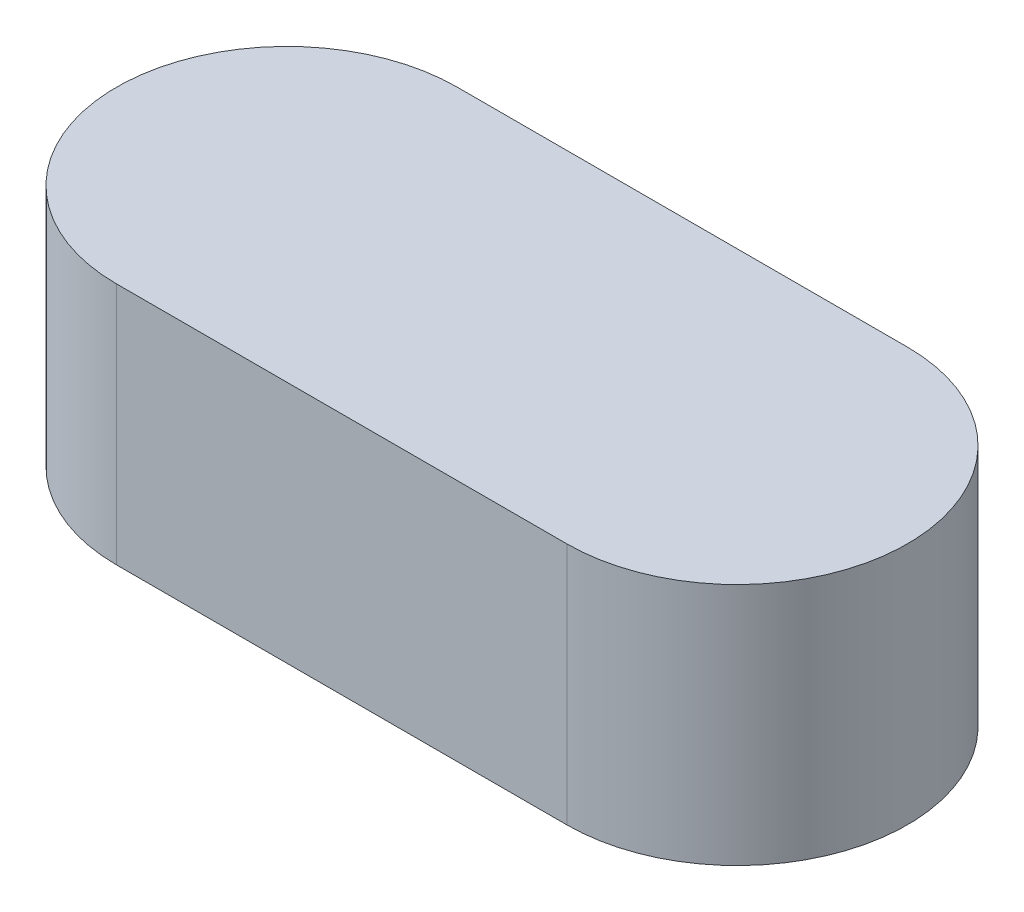
ISO-10303-21;
HEADER;
FILE_DESCRIPTION(('STEP AP214'),'2;1');
FILE_NAME('part.step','',(''),(''),'','','');
FILE_SCHEMA(('AUTOMOTIVE_DESIGN { 1 0 10303 214 1 1 1 1 }'));
ENDSEC;
DATA;
#1=APPLICATION_CONTEXT('core data for automotive mechanical design processes');
#2=APPLICATION_PROTOCOL_DEFINITION('international standard','automotive_design',2000,#1);
#3=PRODUCT_CONTEXT('',#1,'mechanical');
#4=PRODUCT('Part','Part','',(#3));
#5=PRODUCT_RELATED_PRODUCT_CATEGORY('part','',(#4));
#6=PRODUCT_DEFINITION_FORMATION('','',#4);
#7=PRODUCT_DEFINITION_CONTEXT('part definition',#1,'design');
#8=PRODUCT_DEFINITION('design','',#6,#7);
#9=PRODUCT_DEFINITION_SHAPE('','',#8);
#10=(LENGTH_UNIT() NAMED_UNIT(*) SI_UNIT(.MILLI.,.METRE.));
#11=(NAMED_UNIT(*) PLANE_ANGLE_UNIT() SI_UNIT($,.RADIAN.));
#12=(NAMED_UNIT(*) SI_UNIT($,.STERADIAN.) SOLID_ANGLE_UNIT());
#13=UNCERTAINTY_MEASURE_WITH_UNIT(LENGTH_MEASURE(1.E-05),#10,'distance_accuracy_value','');
#14=(GEOMETRIC_REPRESENTATION_CONTEXT(3) GLOBAL_UNCERTAINTY_ASSIGNED_CONTEXT((#13)) GLOBAL_UNIT_ASSIGNED_CONTEXT((#10,
#11,#12)) REPRESENTATION_CONTEXT('',''));
#15=CARTESIAN_POINT('',(0.,0.,0.));
#16=DIRECTION('',(0.,0.,1.));
#17=DIRECTION('',(1.,0.,0.));
#18=AXIS2_PLACEMENT_3D('',#15,#16,#17);
#19=CARTESIAN_POINT('',(-18.5,10.,0.));
#20=DIRECTION('',(0.,-1.,0.));
#21=DIRECTION('',(0.,0.,-1.));
#22=AXIS2_PLACEMENT_3D('',#19,#20,#21);
#23=CYLINDRICAL_SURFACE('',#22,14.);
#24=CARTESIAN_POINT('',(-18.5,-10.,0.));
#25=DIRECTION('',(0.,1.,0.));
#26=DIRECTION('',(0.,0.,1.));
#27=AXIS2_PLACEMENT_3D('',#24,#25,#26);
#28=CIRCLE('',#27,14.);
#29=CARTESIAN_POINT('',(-18.5,-10.,-14.));
#30=VERTEX_POINT('',#29);
#31=CARTESIAN_POINT('',(-18.5,-10.,14.));
#32=VERTEX_POINT('',#31);
#33=EDGE_CURVE('E102',#30,#32,#28,.T.);
#34=ORIENTED_EDGE('',*,*,#33,.T.);
#35=DIRECTION('',(0.,-1.,0.));
#36=VECTOR('',#35,1.);
#37=CARTESIAN_POINT('',(-18.5,10.,14.));
#38=LINE('',#37,#36);
#39=CARTESIAN_POINT('',(-18.5,10.,14.));
#40=VERTEX_POINT('',#39);
#41=EDGE_CURVE('E11',#40,#32,#38,.T.);
#42=ORIENTED_EDGE('',*,*,#41,.F.);
#43=CARTESIAN_POINT('',(-18.5,10.,0.));
#44=DIRECTION('',(0.,1.,0.));
#45=DIRECTION('',(0.,0.,1.));
#46=AXIS2_PLACEMENT_3D('',#43,#44,#45);
#47=CIRCLE('',#46,14.);
#48=CARTESIAN_POINT('',(-18.5,10.,-14.));
#49=VERTEX_POINT('',#48);
#50=EDGE_CURVE('E88',#49,#40,#47,.T.);
#51=ORIENTED_EDGE('',*,*,#50,.F.);
#52=DIRECTION('',(0.,-1.,0.));
#53=VECTOR('',#52,1.);
#54=CARTESIAN_POINT('',(-18.5,10.,-14.));
#55=LINE('',#54,#53);
#56=EDGE_CURVE('E55',#49,#30,#55,.T.);
#57=ORIENTED_EDGE('',*,*,#56,.T.);
#58=EDGE_LOOP('',(#34,#42,#51,#57));
#59=FACE_BOUND('',#58,.T.);
#60=ADVANCED_FACE('F39',(#59),#23,.T.);
#61=CARTESIAN_POINT('',(-18.5,10.,14.));
#62=DIRECTION('',(0.,0.,-1.));
#63=DIRECTION('',(-1.,0.,0.));
#64=AXIS2_PLACEMENT_3D('',#61,#62,#63);
#65=PLANE('',#64);
#66=DIRECTION('',(1.,0.,0.));
#67=VECTOR('',#66,1.);
#68=CARTESIAN_POINT('',(-18.5,-10.,14.));
#69=LINE('',#68,#67);
#70=CARTESIAN_POINT('',(18.5,-10.,14.));
#71=VERTEX_POINT('',#70);
#72=EDGE_CURVE('E93',#32,#71,#69,.T.);
#73=ORIENTED_EDGE('',*,*,#72,.T.);
#74=DIRECTION('',(0.,-1.,0.));
#75=VECTOR('',#74,1.);
#76=CARTESIAN_POINT('',(18.5,10.,14.));
#77=LINE('',#76,#75);
#78=CARTESIAN_POINT('',(18.5,10.,14.));
#79=VERTEX_POINT('',#78);
#80=EDGE_CURVE('E47',#79,#71,#77,.T.);
#81=ORIENTED_EDGE('',*,*,#80,.F.);
#82=DIRECTION('',(1.,0.,0.));
#83=VECTOR('',#82,1.);
#84=CARTESIAN_POINT('',(-18.5,10.,14.));
#85=LINE('',#84,#83);
#86=EDGE_CURVE('E80',#40,#79,#85,.T.);
#87=ORIENTED_EDGE('',*,*,#86,.F.);
#88=ORIENTED_EDGE('',*,*,#41,.T.);
#89=EDGE_LOOP('',(#73,#81,#87,#88));
#90=FACE_BOUND('',#89,.T.);
#91=ADVANCED_FACE('F92',(#90),#65,.F.);
#92=CARTESIAN_POINT('',(18.5,10.,0.));
#93=DIRECTION('',(0.,-1.,0.));
#94=DIRECTION('',(0.,0.,-1.));
#95=AXIS2_PLACEMENT_3D('',#92,#93,#94);
#96=CYLINDRICAL_SURFACE('',#95,14.);
#97=CARTESIAN_POINT('',(18.5,-10.,0.));
#98=DIRECTION('',(0.,-1.,0.));
#99=DIRECTION('',(0.,0.,-1.));
#100=AXIS2_PLACEMENT_3D('',#97,#98,#99);
#101=CIRCLE('',#100,14.);
#102=CARTESIAN_POINT('',(18.5,-10.,-14.));
#103=VERTEX_POINT('',#102);
#104=EDGE_CURVE('E105',#103,#71,#101,.T.);
#105=ORIENTED_EDGE('',*,*,#104,.F.);
#106=DIRECTION('',(0.,-1.,0.));
#107=VECTOR('',#106,1.);
#108=CARTESIAN_POINT('',(18.5,10.,-14.));
#109=LINE('',#108,#107);
#110=CARTESIAN_POINT('',(18.5,10.,-14.));
#111=VERTEX_POINT('',#110);
#112=EDGE_CURVE('E69',#111,#103,#109,.T.);
#113=ORIENTED_EDGE('',*,*,#112,.F.);
#114=CARTESIAN_POINT('',(18.5,10.,0.));
#115=DIRECTION('',(0.,-1.,0.));
#116=DIRECTION('',(0.,0.,-1.));
#117=AXIS2_PLACEMENT_3D('',#114,#115,#116);
#118=CIRCLE('',#117,14.);
#119=EDGE_CURVE('E87',#111,#79,#118,.T.);
#120=ORIENTED_EDGE('',*,*,#119,.T.);
#121=ORIENTED_EDGE('',*,*,#80,.T.);
#122=EDGE_LOOP('',(#105,#113,#120,#121));
#123=FACE_BOUND('',#122,.T.);
#124=ADVANCED_FACE('F96',(#123),#96,.T.);
#125=CARTESIAN_POINT('',(-18.5,10.,-14.));
#126=DIRECTION('',(0.,0.,-1.));
#127=DIRECTION('',(-1.,0.,0.));
#128=AXIS2_PLACEMENT_3D('',#125,#126,#127);
#129=PLANE('',#128);
#130=DIRECTION('',(1.,0.,0.));
#131=VECTOR('',#130,1.);
#132=CARTESIAN_POINT('',(-18.5,-10.,-14.));
#133=LINE('',#132,#131);
#134=EDGE_CURVE('E107',#30,#103,#133,.T.);
#135=ORIENTED_EDGE('',*,*,#134,.F.);
#136=ORIENTED_EDGE('',*,*,#56,.F.);
#137=DIRECTION('',(1.,0.,0.));
#138=VECTOR('',#137,1.);
#139=CARTESIAN_POINT('',(-18.5,10.,-14.));
#140=LINE('',#139,#138);
#141=EDGE_CURVE('E97',#49,#111,#140,.T.);
#142=ORIENTED_EDGE('',*,*,#141,.T.);
#143=ORIENTED_EDGE('',*,*,#112,.T.);
#144=EDGE_LOOP('',(#135,#136,#142,#143));
#145=FACE_BOUND('',#144,.T.);
#146=ADVANCED_FACE('F113',(#145),#129,.T.);
#147=CARTESIAN_POINT('',(-18.5,10.,0.));
#148=DIRECTION('',(0.,1.,0.));
#149=DIRECTION('',(0.,0.,1.));
#150=AXIS2_PLACEMENT_3D('',#147,#148,#149);
#151=PLANE('',#150);
#152=ORIENTED_EDGE('',*,*,#50,.T.);
#153=ORIENTED_EDGE('',*,*,#86,.T.);
#154=ORIENTED_EDGE('',*,*,#119,.F.);
#155=ORIENTED_EDGE('',*,*,#141,.F.);
#156=EDGE_LOOP('',(#152,#153,#154,#155));
#157=FACE_BOUND('',#156,.T.);
#158=ADVANCED_FACE('F84',(#157),#151,.T.);
#159=CARTESIAN_POINT('',(-18.5,-10.,0.));
#160=DIRECTION('',(0.,1.,0.));
#161=DIRECTION('',(0.,0.,1.));
#162=AXIS2_PLACEMENT_3D('',#159,#160,#161);
#163=PLANE('',#162);
#164=ORIENTED_EDGE('',*,*,#33,.F.);
#165=ORIENTED_EDGE('',*,*,#134,.T.);
#166=ORIENTED_EDGE('',*,*,#104,.T.);
#167=ORIENTED_EDGE('',*,*,#72,.F.);
#168=EDGE_LOOP('',(#164,#165,#166,#167));
#169=FACE_BOUND('',#168,.T.);
#170=ADVANCED_FACE('F112',(#169),#163,.F.);
#171=CLOSED_SHELL('',(#60,#91,#124,#146,#158,#170));
#172=MANIFOLD_SOLID_BREP('B2',#171);
#173=ADVANCED_BREP_SHAPE_REPRESENTATION('',(#18,#172),#14);
#174=SHAPE_DEFINITION_REPRESENTATION(#9,#173);
ENDSEC;
END-ISO-10303-21;
